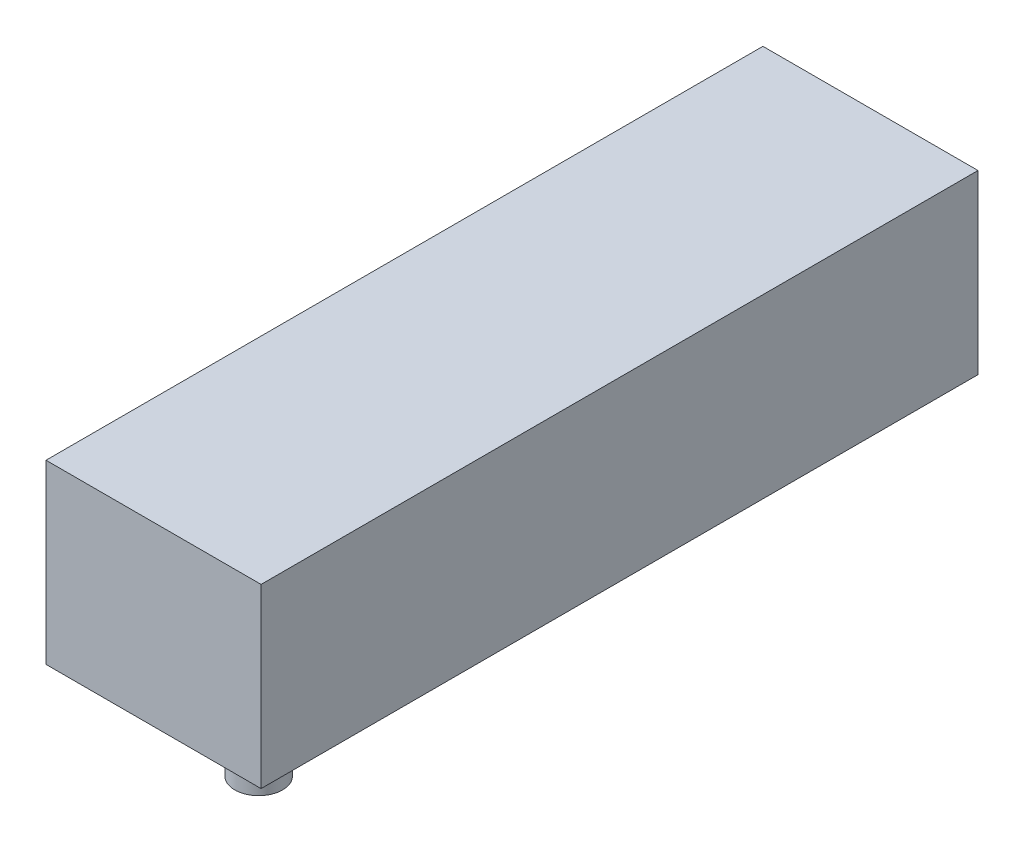
ISO-10303-21;
HEADER;
FILE_DESCRIPTION(('STEP AP214'),'2;1');
FILE_NAME('part.step','',(''),(''),'','','');
FILE_SCHEMA(('AUTOMOTIVE_DESIGN { 1 0 10303 214 1 1 1 1 }'));
ENDSEC;
DATA;
#1=APPLICATION_CONTEXT('core data for automotive mechanical design processes');
#2=APPLICATION_PROTOCOL_DEFINITION('international standard','automotive_design',2000,#1);
#3=PRODUCT_CONTEXT('',#1,'mechanical');
#4=PRODUCT('Part','Part','',(#3));
#5=PRODUCT_RELATED_PRODUCT_CATEGORY('part','',(#4));
#6=PRODUCT_DEFINITION_FORMATION('','',#4);
#7=PRODUCT_DEFINITION_CONTEXT('part definition',#1,'design');
#8=PRODUCT_DEFINITION('design','',#6,#7);
#9=PRODUCT_DEFINITION_SHAPE('','',#8);
#10=(LENGTH_UNIT() NAMED_UNIT(*) SI_UNIT(.MILLI.,.METRE.));
#11=(NAMED_UNIT(*) PLANE_ANGLE_UNIT() SI_UNIT($,.RADIAN.));
#12=(NAMED_UNIT(*) SI_UNIT($,.STERADIAN.) SOLID_ANGLE_UNIT());
#13=UNCERTAINTY_MEASURE_WITH_UNIT(LENGTH_MEASURE(1.E-05),#10,'distance_accuracy_value','');
#14=(GEOMETRIC_REPRESENTATION_CONTEXT(3) GLOBAL_UNCERTAINTY_ASSIGNED_CONTEXT((#13)) GLOBAL_UNIT_ASSIGNED_CONTEXT((#10,
#11,#12)) REPRESENTATION_CONTEXT('',''));
#15=CARTESIAN_POINT('',(0.,0.,0.));
#16=DIRECTION('',(0.,0.,1.));
#17=DIRECTION('',(1.,0.,0.));
#18=AXIS2_PLACEMENT_3D('',#15,#16,#17);
#19=CARTESIAN_POINT('',(-9.59540076258483,18.5,64.3057366755007));
#20=DIRECTION('',(1.,0.,0.));
#21=DIRECTION('',(0.,0.,-1.));
#22=AXIS2_PLACEMENT_3D('',#19,#20,#21);
#23=PLANE('',#22);
#24=DIRECTION('',(0.,0.,1.));
#25=VECTOR('',#24,1.);
#26=CARTESIAN_POINT('',(-9.59540076258483,0.,64.3057366755007));
#27=LINE('',#26,#25);
#28=CARTESIAN_POINT('',(-9.59540076258483,0.,-10.6942633244993));
#29=VERTEX_POINT('',#28);
#30=CARTESIAN_POINT('',(-9.59540076258483,0.,64.3057366755007));
#31=VERTEX_POINT('',#30);
#32=EDGE_CURVE('E107',#29,#31,#27,.T.);
#33=ORIENTED_EDGE('',*,*,#32,.T.);
#34=DIRECTION('',(0.,-1.,0.));
#35=VECTOR('',#34,1.);
#36=CARTESIAN_POINT('',(-9.59540076258483,18.5,64.3057366755007));
#37=LINE('',#36,#35);
#38=CARTESIAN_POINT('',(-9.59540076258483,18.5,64.3057366755007));
#39=VERTEX_POINT('',#38);
#40=EDGE_CURVE('E11',#39,#31,#37,.T.);
#41=ORIENTED_EDGE('',*,*,#40,.F.);
#42=DIRECTION('',(0.,0.,1.));
#43=VECTOR('',#42,1.);
#44=CARTESIAN_POINT('',(-9.59540076258483,18.5,64.3057366755007));
#45=LINE('',#44,#43);
#46=CARTESIAN_POINT('',(-9.59540076258483,18.5,-10.6942633244993));
#47=VERTEX_POINT('',#46);
#48=EDGE_CURVE('E91',#47,#39,#45,.T.);
#49=ORIENTED_EDGE('',*,*,#48,.F.);
#50=DIRECTION('',(0.,-1.,0.));
#51=VECTOR('',#50,1.);
#52=CARTESIAN_POINT('',(-9.59540076258483,18.5,-10.6942633244993));
#53=LINE('',#52,#51);
#54=EDGE_CURVE('E103',#47,#29,#53,.T.);
#55=ORIENTED_EDGE('',*,*,#54,.T.);
#56=EDGE_LOOP('',(#33,#41,#49,#55));
#57=FACE_BOUND('',#56,.T.);
#58=ADVANCED_FACE('F39',(#57),#23,.F.);
#59=CARTESIAN_POINT('',(-9.59540076258483,18.5,64.3057366755007));
#60=DIRECTION('',(0.,0.,-1.));
#61=DIRECTION('',(-1.,0.,0.));
#62=AXIS2_PLACEMENT_3D('',#59,#60,#61);
#63=PLANE('',#62);
#64=DIRECTION('',(1.,0.,0.));
#65=VECTOR('',#64,1.);
#66=CARTESIAN_POINT('',(-9.59540076258483,0.,64.3057366755007));
#67=LINE('',#66,#65);
#68=CARTESIAN_POINT('',(12.9045992374152,0.,64.3057366755007));
#69=VERTEX_POINT('',#68);
#70=EDGE_CURVE('E96',#31,#69,#67,.T.);
#71=ORIENTED_EDGE('',*,*,#70,.T.);
#72=DIRECTION('',(0.,-1.,0.));
#73=VECTOR('',#72,1.);
#74=CARTESIAN_POINT('',(12.9045992374152,18.5,64.3057366755007));
#75=LINE('',#74,#73);
#76=CARTESIAN_POINT('',(12.9045992374152,18.5,64.3057366755007));
#77=VERTEX_POINT('',#76);
#78=EDGE_CURVE('E48',#77,#69,#75,.T.);
#79=ORIENTED_EDGE('',*,*,#78,.F.);
#80=DIRECTION('',(1.,0.,0.));
#81=VECTOR('',#80,1.);
#82=CARTESIAN_POINT('',(-9.59540076258483,18.5,64.3057366755007));
#83=LINE('',#82,#81);
#84=EDGE_CURVE('E86',#39,#77,#83,.T.);
#85=ORIENTED_EDGE('',*,*,#84,.F.);
#86=ORIENTED_EDGE('',*,*,#40,.T.);
#87=EDGE_LOOP('',(#71,#79,#85,#86));
#88=FACE_BOUND('',#87,.T.);
#89=ADVANCED_FACE('F95',(#88),#63,.F.);
#90=CARTESIAN_POINT('',(12.9045992374152,18.5,64.3057366755007));
#91=DIRECTION('',(-1.,0.,0.));
#92=DIRECTION('',(0.,0.,1.));
#93=AXIS2_PLACEMENT_3D('',#90,#91,#92);
#94=PLANE('',#93);
#95=DIRECTION('',(0.,0.,-1.));
#96=VECTOR('',#95,1.);
#97=CARTESIAN_POINT('',(12.9045992374152,0.,64.3057366755007));
#98=LINE('',#97,#96);
#99=CARTESIAN_POINT('',(12.9045992374152,0.,-10.6942633244993));
#100=VERTEX_POINT('',#99);
#101=EDGE_CURVE('E73',#69,#100,#98,.T.);
#102=ORIENTED_EDGE('',*,*,#101,.T.);
#103=DIRECTION('',(0.,-1.,0.));
#104=VECTOR('',#103,1.);
#105=CARTESIAN_POINT('',(12.9045992374152,18.5,-10.6942633244993));
#106=LINE('',#105,#104);
#107=CARTESIAN_POINT('',(12.9045992374152,18.5,-10.6942633244993));
#108=VERTEX_POINT('',#107);
#109=EDGE_CURVE('E98',#108,#100,#106,.T.);
#110=ORIENTED_EDGE('',*,*,#109,.F.);
#111=DIRECTION('',(0.,0.,-1.));
#112=VECTOR('',#111,1.);
#113=CARTESIAN_POINT('',(12.9045992374152,18.5,64.3057366755007));
#114=LINE('',#113,#112);
#115=EDGE_CURVE('E89',#77,#108,#114,.T.);
#116=ORIENTED_EDGE('',*,*,#115,.F.);
#117=ORIENTED_EDGE('',*,*,#78,.T.);
#118=EDGE_LOOP('',(#102,#110,#116,#117));
#119=FACE_BOUND('',#118,.T.);
#120=ADVANCED_FACE('F99',(#119),#94,.F.);
#121=CARTESIAN_POINT('',(-9.59540076258483,18.5,-10.6942633244993));
#122=DIRECTION('',(0.,0.,1.));
#123=DIRECTION('',(1.,0.,0.));
#124=AXIS2_PLACEMENT_3D('',#121,#122,#123);
#125=PLANE('',#124);
#126=DIRECTION('',(-1.,0.,0.));
#127=VECTOR('',#126,1.);
#128=CARTESIAN_POINT('',(-9.59540076258483,0.,-10.6942633244993));
#129=LINE('',#128,#127);
#130=EDGE_CURVE('E79',#100,#29,#129,.T.);
#131=ORIENTED_EDGE('',*,*,#130,.T.);
#132=ORIENTED_EDGE('',*,*,#54,.F.);
#133=DIRECTION('',(-1.,0.,0.));
#134=VECTOR('',#133,1.);
#135=CARTESIAN_POINT('',(-9.59540076258483,18.5,-10.6942633244993));
#136=LINE('',#135,#134);
#137=EDGE_CURVE('E56',#108,#47,#136,.T.);
#138=ORIENTED_EDGE('',*,*,#137,.F.);
#139=ORIENTED_EDGE('',*,*,#109,.T.);
#140=EDGE_LOOP('',(#131,#132,#138,#139));
#141=FACE_BOUND('',#140,.T.);
#142=ADVANCED_FACE('F121',(#141),#125,.F.);
#143=CARTESIAN_POINT('',(0.,18.5,0.));
#144=DIRECTION('',(0.,-1.,0.));
#145=DIRECTION('',(0.,0.,-1.));
#146=AXIS2_PLACEMENT_3D('',#143,#144,#145);
#147=PLANE('',#146);
#148=ORIENTED_EDGE('',*,*,#48,.T.);
#149=ORIENTED_EDGE('',*,*,#84,.T.);
#150=ORIENTED_EDGE('',*,*,#115,.T.);
#151=ORIENTED_EDGE('',*,*,#137,.T.);
#152=EDGE_LOOP('',(#148,#149,#150,#151));
#153=FACE_BOUND('',#152,.T.);
#154=ADVANCED_FACE('F87',(#153),#147,.F.);
#155=CARTESIAN_POINT('',(0.,0.,0.));
#156=DIRECTION('',(0.,-1.,0.));
#157=DIRECTION('',(0.,0.,-1.));
#158=AXIS2_PLACEMENT_3D('',#155,#156,#157);
#159=PLANE('',#158);
#160=CARTESIAN_POINT('',(1.65459923741517,0.,53.3057366755007));
#161=DIRECTION('',(0.,-1.,0.));
#162=DIRECTION('',(0.,0.,-1.));
#163=AXIS2_PLACEMENT_3D('',#160,#161,#162);
#164=CIRCLE('',#163,2.5);
#165=CARTESIAN_POINT('',(1.65459923741517,0.,50.8057366755007));
#166=VERTEX_POINT('',#165);
#167=EDGE_CURVE('E128',#166,#166,#164,.T.);
#168=ORIENTED_EDGE('',*,*,#167,.F.);
#169=EDGE_LOOP('',(#168));
#170=FACE_BOUND('',#169,.T.);
#171=ORIENTED_EDGE('',*,*,#32,.F.);
#172=ORIENTED_EDGE('',*,*,#130,.F.);
#173=ORIENTED_EDGE('',*,*,#101,.F.);
#174=ORIENTED_EDGE('',*,*,#70,.F.);
#175=EDGE_LOOP('',(#171,#172,#173,#174));
#176=FACE_BOUND('',#175,.T.);
#177=ADVANCED_FACE('F124',(#170,#176),#159,.T.);
#178=CARTESIAN_POINT('',(1.65459923741517,-10.,53.3057366755007));
#179=DIRECTION('',(0.,1.,0.));
#180=DIRECTION('',(0.,0.,1.));
#181=AXIS2_PLACEMENT_3D('',#178,#179,#180);
#182=CYLINDRICAL_SURFACE('',#181,2.5);
#183=CARTESIAN_POINT('',(1.65459923741517,-10.,53.3057366755007));
#184=DIRECTION('',(0.,-1.,0.));
#185=DIRECTION('',(0.,0.,-1.));
#186=AXIS2_PLACEMENT_3D('',#183,#184,#185);
#187=CIRCLE('',#186,2.5);
#188=CARTESIAN_POINT('',(1.65459923741517,-10.,50.8057366755007));
#189=VERTEX_POINT('',#188);
#190=EDGE_CURVE('E111',#189,#189,#187,.T.);
#191=ORIENTED_EDGE('',*,*,#190,.F.);
#192=EDGE_LOOP('',(#191));
#193=FACE_BOUND('',#192,.T.);
#194=ORIENTED_EDGE('',*,*,#167,.T.);
#195=EDGE_LOOP('',(#194));
#196=FACE_BOUND('',#195,.T.);
#197=ADVANCED_FACE('F138',(#193,#196),#182,.T.);
#198=CARTESIAN_POINT('',(1.65459923741517,-10.,53.3057366755007));
#199=DIRECTION('',(0.,-1.,0.));
#200=DIRECTION('',(0.,0.,-1.));
#201=AXIS2_PLACEMENT_3D('',#198,#199,#200);
#202=PLANE('',#201);
#203=ORIENTED_EDGE('',*,*,#190,.T.);
#204=EDGE_LOOP('',(#203));
#205=FACE_BOUND('',#204,.T.);
#206=ADVANCED_FACE('F136',(#205),#202,.T.);
#207=CLOSED_SHELL('',(#58,#89,#120,#142,#154,#177,#197,#206));
#208=MANIFOLD_SOLID_BREP('B2',#207);
#209=ADVANCED_BREP_SHAPE_REPRESENTATION('',(#18,#208),#14);
#210=SHAPE_DEFINITION_REPRESENTATION(#9,#209);
ENDSEC;
END-ISO-10303-21;
